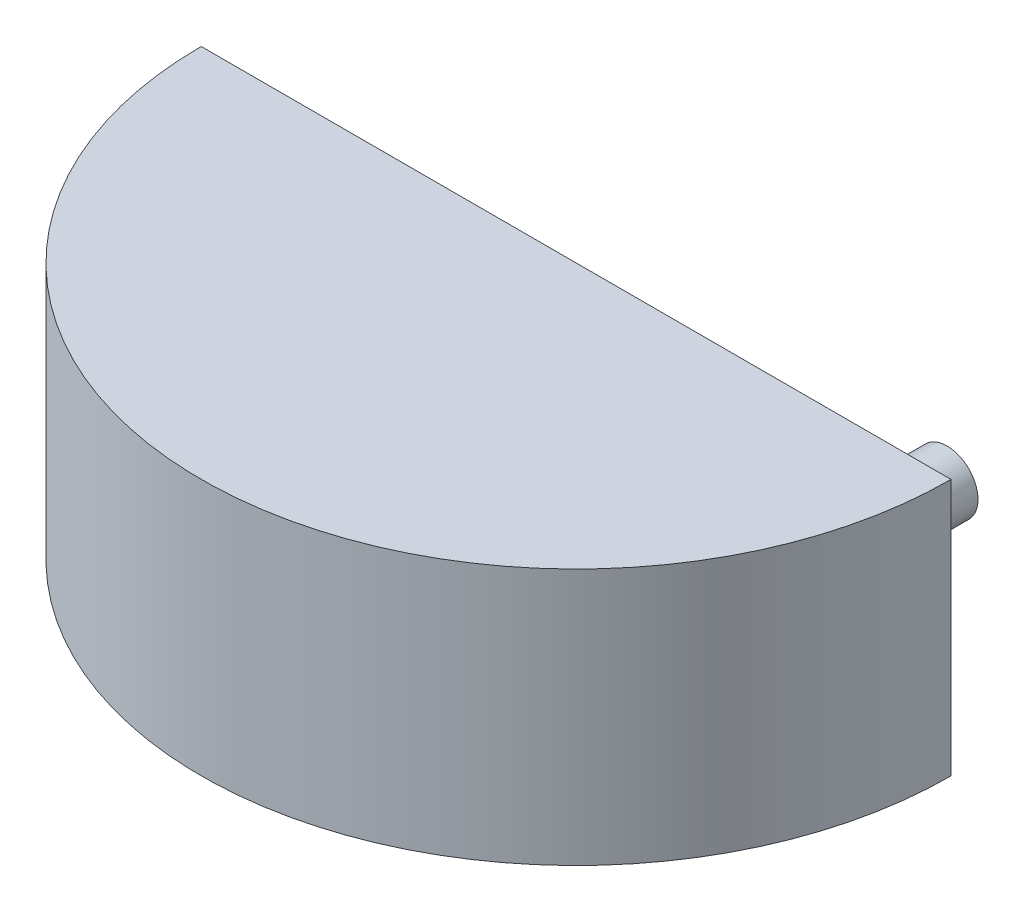
ISO-10303-21;
HEADER;
FILE_DESCRIPTION(('STEP AP214'),'2;1');
FILE_NAME('part.step','',(''),(''),'','','');
FILE_SCHEMA(('AUTOMOTIVE_DESIGN { 1 0 10303 214 1 1 1 1 }'));
ENDSEC;
DATA;
#1=APPLICATION_CONTEXT('core data for automotive mechanical design processes');
#2=APPLICATION_PROTOCOL_DEFINITION('international standard','automotive_design',2000,#1);
#3=PRODUCT_CONTEXT('',#1,'mechanical');
#4=PRODUCT('Part','Part','',(#3));
#5=PRODUCT_RELATED_PRODUCT_CATEGORY('part','',(#4));
#6=PRODUCT_DEFINITION_FORMATION('','',#4);
#7=PRODUCT_DEFINITION_CONTEXT('part definition',#1,'design');
#8=PRODUCT_DEFINITION('design','',#6,#7);
#9=PRODUCT_DEFINITION_SHAPE('','',#8);
#10=(LENGTH_UNIT() NAMED_UNIT(*) SI_UNIT(.MILLI.,.METRE.));
#11=(NAMED_UNIT(*) PLANE_ANGLE_UNIT() SI_UNIT($,.RADIAN.));
#12=(NAMED_UNIT(*) SI_UNIT($,.STERADIAN.) SOLID_ANGLE_UNIT());
#13=UNCERTAINTY_MEASURE_WITH_UNIT(LENGTH_MEASURE(1.E-05),#10,'distance_accuracy_value','');
#14=(GEOMETRIC_REPRESENTATION_CONTEXT(3) GLOBAL_UNCERTAINTY_ASSIGNED_CONTEXT((#13)) GLOBAL_UNIT_ASSIGNED_CONTEXT((#10,
#11,#12)) REPRESENTATION_CONTEXT('',''));
#15=CARTESIAN_POINT('',(0.,0.,0.));
#16=DIRECTION('',(0.,0.,1.));
#17=DIRECTION('',(1.,0.,0.));
#18=AXIS2_PLACEMENT_3D('',#15,#16,#17);
#19=CARTESIAN_POINT('',(0.,0.,0.));
#20=DIRECTION('',(0.,-1.,0.));
#21=DIRECTION('',(1.,0.,0.));
#22=AXIS2_PLACEMENT_3D('',#19,#20,#21);
#23=PLANE('',#22);
#24=DIRECTION('',(-1.,0.,0.));
#25=VECTOR('',#24,1.);
#26=CARTESIAN_POINT('',(0.,0.,0.));
#27=LINE('',#26,#25);
#28=CARTESIAN_POINT('',(-0.79375,0.,0.));
#29=VERTEX_POINT('',#28);
#30=CARTESIAN_POINT('',(-4.11162499999997,0.,0.));
#31=VERTEX_POINT('',#30);
#32=EDGE_CURVE('E60',#29,#31,#27,.T.);
#33=ORIENTED_EDGE('',*,*,#32,.F.);
#34=DIRECTION('',(0.,0.,1.));
#35=VECTOR('',#34,1.);
#36=CARTESIAN_POINT('',(-0.79375,0.,0.));
#37=LINE('',#36,#35);
#38=CARTESIAN_POINT('',(-0.79375,0.,6.35));
#39=VERTEX_POINT('',#38);
#40=EDGE_CURVE('E55',#29,#39,#37,.T.);
#41=ORIENTED_EDGE('',*,*,#40,.T.);
#42=DIRECTION('',(-1.,0.,0.));
#43=VECTOR('',#42,1.);
#44=CARTESIAN_POINT('',(0.,0.,6.35));
#45=LINE('',#44,#43);
#46=CARTESIAN_POINT('',(0.79375,0.,6.35));
#47=VERTEX_POINT('',#46);
#48=EDGE_CURVE('E150',#47,#39,#45,.T.);
#49=ORIENTED_EDGE('',*,*,#48,.F.);
#50=DIRECTION('',(0.,0.,1.));
#51=VECTOR('',#50,1.);
#52=CARTESIAN_POINT('',(0.79375,0.,0.));
#53=LINE('',#52,#51);
#54=CARTESIAN_POINT('',(0.79375,0.,0.));
#55=VERTEX_POINT('',#54);
#56=EDGE_CURVE('E153',#55,#47,#53,.T.);
#57=ORIENTED_EDGE('',*,*,#56,.F.);
#58=CARTESIAN_POINT('',(4.11162499999997,0.,0.));
#59=VERTEX_POINT('',#58);
#60=EDGE_CURVE('E222',#59,#55,#27,.T.);
#61=ORIENTED_EDGE('',*,*,#60,.F.);
#62=CARTESIAN_POINT('',(5.30224999999997,0.,0.));
#63=DIRECTION('',(0.,-1.,0.));
#64=DIRECTION('',(1.,0.,0.));
#65=AXIS2_PLACEMENT_3D('',#62,#63,#64);
#66=CIRCLE('',#65,1.190625);
#67=CARTESIAN_POINT('',(6.49287499999997,0.,0.));
#68=VERTEX_POINT('',#67);
#69=EDGE_CURVE('E185',#68,#59,#66,.T.);
#70=ORIENTED_EDGE('',*,*,#69,.F.);
#71=CARTESIAN_POINT('',(9.27099999999997,0.,0.));
#72=VERTEX_POINT('',#71);
#73=EDGE_CURVE('E218',#72,#68,#27,.T.);
#74=ORIENTED_EDGE('',*,*,#73,.F.);
#75=CARTESIAN_POINT('',(0.,0.,0.));
#76=DIRECTION('',(0.,-1.,0.));
#77=DIRECTION('',(1.,0.,0.));
#78=AXIS2_PLACEMENT_3D('',#75,#76,#77);
#79=CIRCLE('',#78,9.27099999999997);
#80=CARTESIAN_POINT('',(-9.27099999999997,0.,0.));
#81=VERTEX_POINT('',#80);
#82=EDGE_CURVE('E228',#72,#81,#79,.T.);
#83=ORIENTED_EDGE('',*,*,#82,.T.);
#84=CARTESIAN_POINT('',(-6.49287499999997,0.,0.));
#85=VERTEX_POINT('',#84);
#86=EDGE_CURVE('E217',#85,#81,#27,.T.);
#87=ORIENTED_EDGE('',*,*,#86,.F.);
#88=CARTESIAN_POINT('',(-5.30224999999997,0.,0.));
#89=DIRECTION('',(0.,-1.,0.));
#90=DIRECTION('',(1.,0.,0.));
#91=AXIS2_PLACEMENT_3D('',#88,#89,#90);
#92=CIRCLE('',#91,1.190625);
#93=EDGE_CURVE('E184',#31,#85,#92,.T.);
#94=ORIENTED_EDGE('',*,*,#93,.F.);
#95=EDGE_LOOP('',(#33,#41,#49,#57,#61,#70,#74,#83,#87,#94));
#96=FACE_BOUND('',#95,.T.);
#97=ADVANCED_FACE('F40',(#96),#23,.T.);
#98=CARTESIAN_POINT('',(0.,-3.04800000000002,0.));
#99=DIRECTION('',(0.,0.,1.));
#100=DIRECTION('',(1.,0.,0.));
#101=AXIS2_PLACEMENT_3D('',#98,#99,#100);
#102=PLANE('',#101);
#103=DIRECTION('',(-1.,0.,0.));
#104=VECTOR('',#103,1.);
#105=CARTESIAN_POINT('',(0.,1.58749999999998,0.));
#106=LINE('',#105,#104);
#107=CARTESIAN_POINT('',(4.11162499999997,1.58749999999998,0.));
#108=VERTEX_POINT('',#107);
#109=CARTESIAN_POINT('',(-4.11162499999997,1.58749999999998,0.));
#110=VERTEX_POINT('',#109);
#111=EDGE_CURVE('E215',#108,#110,#106,.T.);
#112=ORIENTED_EDGE('',*,*,#111,.F.);
#113=DIRECTION('',(0.,-1.,0.));
#114=VECTOR('',#113,1.);
#115=CARTESIAN_POINT('',(4.11162499999997,3.048,0.));
#116=LINE('',#115,#114);
#117=EDGE_CURVE('E197',#108,#59,#116,.T.);
#118=ORIENTED_EDGE('',*,*,#117,.T.);
#119=ORIENTED_EDGE('',*,*,#60,.T.);
#120=DIRECTION('',(0.,1.,0.));
#121=VECTOR('',#120,1.);
#122=CARTESIAN_POINT('',(0.79375,-0.79375,0.));
#123=LINE('',#122,#121);
#124=CARTESIAN_POINT('',(0.79375,-0.79375,0.));
#125=VERTEX_POINT('',#124);
#126=EDGE_CURVE('E134',#125,#55,#123,.T.);
#127=ORIENTED_EDGE('',*,*,#126,.F.);
#128=DIRECTION('',(1.,0.,0.));
#129=VECTOR('',#128,1.);
#130=CARTESIAN_POINT('',(0.,-0.79375,0.));
#131=LINE('',#130,#129);
#132=CARTESIAN_POINT('',(-0.79375,-0.79375,0.));
#133=VERTEX_POINT('',#132);
#134=EDGE_CURVE('E137',#133,#125,#131,.T.);
#135=ORIENTED_EDGE('',*,*,#134,.F.);
#136=DIRECTION('',(0.,1.,0.));
#137=VECTOR('',#136,1.);
#138=CARTESIAN_POINT('',(-0.79375,-0.79375,0.));
#139=LINE('',#138,#137);
#140=EDGE_CURVE('E127',#133,#29,#139,.T.);
#141=ORIENTED_EDGE('',*,*,#140,.T.);
#142=ORIENTED_EDGE('',*,*,#32,.T.);
#143=DIRECTION('',(0.,-1.,0.));
#144=VECTOR('',#143,1.);
#145=CARTESIAN_POINT('',(-4.11162499999997,3.048,0.));
#146=LINE('',#145,#144);
#147=EDGE_CURVE('E187',#31,#110,#146,.F.);
#148=ORIENTED_EDGE('',*,*,#147,.T.);
#149=EDGE_LOOP('',(#112,#118,#119,#127,#135,#141,#142,#148));
#150=FACE_BOUND('',#149,.T.);
#151=ADVANCED_FACE('F139',(#150),#102,.F.);
#152=CARTESIAN_POINT('',(0.,0.,0.));
#153=DIRECTION('',(0.,-1.,0.));
#154=DIRECTION('',(1.,0.,0.));
#155=AXIS2_PLACEMENT_3D('',#152,#153,#154);
#156=CYLINDRICAL_SURFACE('',#155,9.27099999999997);
#157=DIRECTION('',(0.,-1.,0.));
#158=VECTOR('',#157,1.);
#159=CARTESIAN_POINT('',(9.27099999999997,0.,0.));
#160=LINE('',#159,#158);
#161=CARTESIAN_POINT('',(9.27099999999997,6.34999999999998,0.));
#162=VERTEX_POINT('',#161);
#163=EDGE_CURVE('E214',#162,#72,#160,.T.);
#164=ORIENTED_EDGE('',*,*,#163,.F.);
#165=CARTESIAN_POINT('',(0.,6.35,0.));
#166=DIRECTION('',(0.,-1.,0.));
#167=DIRECTION('',(1.,0.,0.));
#168=AXIS2_PLACEMENT_3D('',#165,#166,#167);
#169=CIRCLE('',#168,9.27099999999997);
#170=CARTESIAN_POINT('',(-9.27099999999997,6.35,0.));
#171=VERTEX_POINT('',#170);
#172=EDGE_CURVE('E225',#162,#171,#169,.T.);
#173=ORIENTED_EDGE('',*,*,#172,.T.);
#174=DIRECTION('',(0.,1.,0.));
#175=VECTOR('',#174,1.);
#176=CARTESIAN_POINT('',(-9.27099999999997,-3.04800000000002,0.));
#177=LINE('',#176,#175);
#178=EDGE_CURVE('E202',#81,#171,#177,.T.);
#179=ORIENTED_EDGE('',*,*,#178,.F.);
#180=ORIENTED_EDGE('',*,*,#82,.F.);
#181=EDGE_LOOP('',(#164,#173,#179,#180));
#182=FACE_BOUND('',#181,.T.);
#183=ADVANCED_FACE('F260',(#182),#156,.T.);
#184=CARTESIAN_POINT('',(0.,6.34999999999998,0.));
#185=DIRECTION('',(0.,1.,0.));
#186=DIRECTION('',(-1.,0.,0.));
#187=AXIS2_PLACEMENT_3D('',#184,#185,#186);
#188=PLANE('',#187);
#189=DIRECTION('',(1.,0.,0.));
#190=VECTOR('',#189,1.);
#191=CARTESIAN_POINT('',(0.,6.34999999999998,0.));
#192=LINE('',#191,#190);
#193=EDGE_CURVE('E200',#171,#162,#192,.T.);
#194=ORIENTED_EDGE('',*,*,#193,.F.);
#195=ORIENTED_EDGE('',*,*,#172,.F.);
#196=EDGE_LOOP('',(#194,#195));
#197=FACE_BOUND('',#196,.T.);
#198=ADVANCED_FACE('F249',(#197),#188,.T.);
#199=CARTESIAN_POINT('',(-8.38199999999997,0.889,0.));
#200=DIRECTION('',(0.,0.,1.));
#201=DIRECTION('',(1.,0.,0.));
#202=AXIS2_PLACEMENT_3D('',#199,#200,#201);
#203=CIRCLE('',#202,0.762000000000001);
#204=CARTESIAN_POINT('',(-7.61999999999997,0.889,0.));
#205=VERTEX_POINT('',#204);
#206=EDGE_CURVE('E11',#205,#205,#203,.F.);
#207=ORIENTED_EDGE('',*,*,#206,.F.);
#208=EDGE_LOOP('',(#207));
#209=FACE_BOUND('',#208,.T.);
#210=CARTESIAN_POINT('',(-8.38199999999997,5.461,0.));
#211=DIRECTION('',(0.,0.,1.));
#212=DIRECTION('',(1.,0.,0.));
#213=AXIS2_PLACEMENT_3D('',#210,#211,#212);
#214=CIRCLE('',#213,0.8255);
#215=CARTESIAN_POINT('',(-7.55649999999997,5.461,0.));
#216=VERTEX_POINT('',#215);
#217=EDGE_CURVE('E170',#216,#216,#214,.T.);
#218=ORIENTED_EDGE('',*,*,#217,.T.);
#219=EDGE_LOOP('',(#218));
#220=FACE_BOUND('',#219,.T.);
#221=CARTESIAN_POINT('',(8.38199999999997,0.889,0.));
#222=DIRECTION('',(0.,0.,1.));
#223=DIRECTION('',(1.,0.,0.));
#224=AXIS2_PLACEMENT_3D('',#221,#222,#223);
#225=CIRCLE('',#224,0.8255);
#226=CARTESIAN_POINT('',(9.20749999999997,0.889,0.));
#227=VERTEX_POINT('',#226);
#228=EDGE_CURVE('E175',#227,#227,#225,.T.);
#229=ORIENTED_EDGE('',*,*,#228,.T.);
#230=EDGE_LOOP('',(#229));
#231=FACE_BOUND('',#230,.T.);
#232=CARTESIAN_POINT('',(8.38199999999997,5.461,0.));
#233=DIRECTION('',(0.,0.,1.));
#234=DIRECTION('',(1.,0.,0.));
#235=AXIS2_PLACEMENT_3D('',#232,#233,#234);
#236=CIRCLE('',#235,0.761999999999999);
#237=CARTESIAN_POINT('',(9.14399999999997,5.461,0.));
#238=VERTEX_POINT('',#237);
#239=EDGE_CURVE('E48',#238,#238,#236,.F.);
#240=ORIENTED_EDGE('',*,*,#239,.F.);
#241=EDGE_LOOP('',(#240));
#242=FACE_BOUND('',#241,.T.);
#243=ORIENTED_EDGE('',*,*,#73,.T.);
#244=DIRECTION('',(0.,-1.,0.));
#245=VECTOR('',#244,1.);
#246=CARTESIAN_POINT('',(6.49287499999997,3.048,0.));
#247=LINE('',#246,#245);
#248=CARTESIAN_POINT('',(6.49287499999997,1.58749999999998,0.));
#249=VERTEX_POINT('',#248);
#250=EDGE_CURVE('E194',#68,#249,#247,.F.);
#251=ORIENTED_EDGE('',*,*,#250,.T.);
#252=CARTESIAN_POINT('',(7.6835,1.58749999999998,0.));
#253=VERTEX_POINT('',#252);
#254=EDGE_CURVE('E211',#253,#249,#106,.T.);
#255=ORIENTED_EDGE('',*,*,#254,.F.);
#256=DIRECTION('',(0.,-1.,0.));
#257=VECTOR('',#256,1.);
#258=CARTESIAN_POINT('',(7.6835,0.,0.));
#259=LINE('',#258,#257);
#260=CARTESIAN_POINT('',(7.6835,4.76249999999998,0.));
#261=VERTEX_POINT('',#260);
#262=EDGE_CURVE('E204',#261,#253,#259,.T.);
#263=ORIENTED_EDGE('',*,*,#262,.F.);
#264=DIRECTION('',(-1.,0.,0.));
#265=VECTOR('',#264,1.);
#266=CARTESIAN_POINT('',(0.,4.76249999999998,0.));
#267=LINE('',#266,#265);
#268=CARTESIAN_POINT('',(-7.6835,4.76249999999998,0.));
#269=VERTEX_POINT('',#268);
#270=EDGE_CURVE('E234',#261,#269,#267,.T.);
#271=ORIENTED_EDGE('',*,*,#270,.T.);
#272=DIRECTION('',(0.,-1.,0.));
#273=VECTOR('',#272,1.);
#274=CARTESIAN_POINT('',(-7.6835,0.,0.));
#275=LINE('',#274,#273);
#276=CARTESIAN_POINT('',(-7.6835,1.58749999999998,0.));
#277=VERTEX_POINT('',#276);
#278=EDGE_CURVE('E207',#277,#269,#275,.F.);
#279=ORIENTED_EDGE('',*,*,#278,.F.);
#280=CARTESIAN_POINT('',(-6.49287499999997,1.58749999999998,0.));
#281=VERTEX_POINT('',#280);
#282=EDGE_CURVE('E210',#281,#277,#106,.T.);
#283=ORIENTED_EDGE('',*,*,#282,.F.);
#284=DIRECTION('',(0.,-1.,0.));
#285=VECTOR('',#284,1.);
#286=CARTESIAN_POINT('',(-6.49287499999997,3.048,0.));
#287=LINE('',#286,#285);
#288=EDGE_CURVE('E191',#281,#85,#287,.T.);
#289=ORIENTED_EDGE('',*,*,#288,.T.);
#290=ORIENTED_EDGE('',*,*,#86,.T.);
#291=ORIENTED_EDGE('',*,*,#178,.T.);
#292=ORIENTED_EDGE('',*,*,#193,.T.);
#293=ORIENTED_EDGE('',*,*,#163,.T.);
#294=EDGE_LOOP('',(#243,#251,#255,#263,#271,#279,#283,#289,#290,#291,#292,#293));
#295=FACE_BOUND('',#294,.T.);
#296=ADVANCED_FACE('F246',(#209,#220,#231,#242,#295),#102,.F.);
#297=CARTESIAN_POINT('',(0.,0.,0.));
#298=DIRECTION('',(0.,-1.,0.));
#299=DIRECTION('',(1.,0.,0.));
#300=AXIS2_PLACEMENT_3D('',#297,#298,#299);
#301=CYLINDRICAL_SURFACE('',#300,7.6835);
#302=CARTESIAN_POINT('',(0.,1.58749999999998,0.));
#303=DIRECTION('',(0.,-1.,0.));
#304=DIRECTION('',(1.,0.,0.));
#305=AXIS2_PLACEMENT_3D('',#302,#303,#304);
#306=CIRCLE('',#305,7.6835);
#307=EDGE_CURVE('E231',#253,#277,#306,.T.);
#308=ORIENTED_EDGE('',*,*,#307,.T.);
#309=ORIENTED_EDGE('',*,*,#278,.T.);
#310=CARTESIAN_POINT('',(0.,4.76249999999998,0.));
#311=DIRECTION('',(0.,-1.,0.));
#312=DIRECTION('',(1.,0.,0.));
#313=AXIS2_PLACEMENT_3D('',#310,#311,#312);
#314=CIRCLE('',#313,7.6835);
#315=EDGE_CURVE('E221',#261,#269,#314,.T.);
#316=ORIENTED_EDGE('',*,*,#315,.F.);
#317=ORIENTED_EDGE('',*,*,#262,.T.);
#318=EDGE_LOOP('',(#308,#309,#316,#317));
#319=FACE_BOUND('',#318,.T.);
#320=ADVANCED_FACE('F42',(#319),#301,.F.);
#321=CARTESIAN_POINT('',(0.,1.58749999999998,0.));
#322=DIRECTION('',(0.,-1.,0.));
#323=DIRECTION('',(1.,0.,0.));
#324=AXIS2_PLACEMENT_3D('',#321,#322,#323);
#325=PLANE('',#324);
#326=ORIENTED_EDGE('',*,*,#254,.T.);
#327=CARTESIAN_POINT('',(5.30224999999997,1.58749999999998,0.));
#328=DIRECTION('',(0.,-1.,0.));
#329=DIRECTION('',(1.,0.,0.));
#330=AXIS2_PLACEMENT_3D('',#327,#328,#329);
#331=CIRCLE('',#330,1.190625);
#332=EDGE_CURVE('E239',#249,#108,#331,.T.);
#333=ORIENTED_EDGE('',*,*,#332,.T.);
#334=ORIENTED_EDGE('',*,*,#111,.T.);
#335=CARTESIAN_POINT('',(-5.30224999999997,1.58749999999998,0.));
#336=DIRECTION('',(0.,-1.,0.));
#337=DIRECTION('',(1.,0.,0.));
#338=AXIS2_PLACEMENT_3D('',#335,#336,#337);
#339=CIRCLE('',#338,1.190625);
#340=EDGE_CURVE('E236',#110,#281,#339,.T.);
#341=ORIENTED_EDGE('',*,*,#340,.T.);
#342=ORIENTED_EDGE('',*,*,#282,.T.);
#343=ORIENTED_EDGE('',*,*,#307,.F.);
#344=EDGE_LOOP('',(#326,#333,#334,#341,#342,#343));
#345=FACE_BOUND('',#344,.T.);
#346=ADVANCED_FACE('F278',(#345),#325,.F.);
#347=CARTESIAN_POINT('',(0.,4.76249999999998,0.));
#348=DIRECTION('',(0.,-1.,0.));
#349=DIRECTION('',(1.,0.,0.));
#350=AXIS2_PLACEMENT_3D('',#347,#348,#349);
#351=PLANE('',#350);
#352=ORIENTED_EDGE('',*,*,#270,.F.);
#353=ORIENTED_EDGE('',*,*,#315,.T.);
#354=EDGE_LOOP('',(#352,#353));
#355=FACE_BOUND('',#354,.T.);
#356=ADVANCED_FACE('F280',(#355),#351,.T.);
#357=CARTESIAN_POINT('',(-5.30224999999997,3.048,0.));
#358=DIRECTION('',(0.,-1.,0.));
#359=DIRECTION('',(1.,0.,0.));
#360=AXIS2_PLACEMENT_3D('',#357,#358,#359);
#361=CYLINDRICAL_SURFACE('',#360,1.190625);
#362=ORIENTED_EDGE('',*,*,#340,.F.);
#363=ORIENTED_EDGE('',*,*,#147,.F.);
#364=ORIENTED_EDGE('',*,*,#93,.T.);
#365=ORIENTED_EDGE('',*,*,#288,.F.);
#366=EDGE_LOOP('',(#362,#363,#364,#365));
#367=FACE_BOUND('',#366,.T.);
#368=ADVANCED_FACE('F286',(#367),#361,.F.);
#369=CARTESIAN_POINT('',(5.30224999999997,3.048,0.));
#370=DIRECTION('',(0.,-1.,0.));
#371=DIRECTION('',(1.,0.,0.));
#372=AXIS2_PLACEMENT_3D('',#369,#370,#371);
#373=CYLINDRICAL_SURFACE('',#372,1.190625);
#374=ORIENTED_EDGE('',*,*,#332,.F.);
#375=ORIENTED_EDGE('',*,*,#250,.F.);
#376=ORIENTED_EDGE('',*,*,#69,.T.);
#377=ORIENTED_EDGE('',*,*,#117,.F.);
#378=EDGE_LOOP('',(#374,#375,#376,#377));
#379=FACE_BOUND('',#378,.T.);
#380=ADVANCED_FACE('F343',(#379),#373,.F.);
#381=CARTESIAN_POINT('',(8.38199999999997,5.461,-0.79375));
#382=DIRECTION('',(0.,0.,1.));
#383=DIRECTION('',(1.,0.,0.));
#384=AXIS2_PLACEMENT_3D('',#381,#382,#383);
#385=CYLINDRICAL_SURFACE('',#384,0.761999999999999);
#386=CARTESIAN_POINT('',(8.38199999999997,5.461,-0.79375));
#387=DIRECTION('',(0.,0.,-1.));
#388=DIRECTION('',(-1.,0.,0.));
#389=AXIS2_PLACEMENT_3D('',#386,#387,#388);
#390=CIRCLE('',#389,0.761999999999999);
#391=CARTESIAN_POINT('',(7.61999999999997,5.461,-0.79375));
#392=VERTEX_POINT('',#391);
#393=EDGE_CURVE('E181',#392,#392,#390,.T.);
#394=ORIENTED_EDGE('',*,*,#393,.F.);
#395=EDGE_LOOP('',(#394));
#396=FACE_BOUND('',#395,.T.);
#397=ORIENTED_EDGE('',*,*,#239,.T.);
#398=EDGE_LOOP('',(#397));
#399=FACE_BOUND('',#398,.T.);
#400=ADVANCED_FACE('F244',(#396,#399),#385,.T.);
#401=CARTESIAN_POINT('',(8.38199999999997,5.461,-0.79375));
#402=DIRECTION('',(0.,0.,-1.));
#403=DIRECTION('',(-1.,0.,0.));
#404=AXIS2_PLACEMENT_3D('',#401,#402,#403);
#405=PLANE('',#404);
#406=ORIENTED_EDGE('',*,*,#393,.T.);
#407=EDGE_LOOP('',(#406));
#408=FACE_BOUND('',#407,.T.);
#409=ADVANCED_FACE('F336',(#408),#405,.T.);
#410=CARTESIAN_POINT('',(-8.38199999999997,0.889,-0.79375));
#411=DIRECTION('',(0.,0.,1.));
#412=DIRECTION('',(1.,0.,0.));
#413=AXIS2_PLACEMENT_3D('',#410,#411,#412);
#414=CYLINDRICAL_SURFACE('',#413,0.762000000000001);
#415=CARTESIAN_POINT('',(-8.38199999999997,0.889,-0.79375));
#416=DIRECTION('',(0.,0.,-1.));
#417=DIRECTION('',(-1.,0.,0.));
#418=AXIS2_PLACEMENT_3D('',#415,#416,#417);
#419=CIRCLE('',#418,0.762000000000001);
#420=CARTESIAN_POINT('',(-9.14399999999997,0.889,-0.79375));
#421=VERTEX_POINT('',#420);
#422=EDGE_CURVE('E178',#421,#421,#419,.T.);
#423=ORIENTED_EDGE('',*,*,#422,.F.);
#424=EDGE_LOOP('',(#423));
#425=FACE_BOUND('',#424,.T.);
#426=ORIENTED_EDGE('',*,*,#206,.T.);
#427=EDGE_LOOP('',(#426));
#428=FACE_BOUND('',#427,.T.);
#429=ADVANCED_FACE('F332',(#425,#428),#414,.T.);
#430=CARTESIAN_POINT('',(-8.38199999999997,0.889,-0.79375));
#431=DIRECTION('',(0.,0.,-1.));
#432=DIRECTION('',(-1.,0.,0.));
#433=AXIS2_PLACEMENT_3D('',#430,#431,#432);
#434=PLANE('',#433);
#435=ORIENTED_EDGE('',*,*,#422,.T.);
#436=EDGE_LOOP('',(#435));
#437=FACE_BOUND('',#436,.T.);
#438=ADVANCED_FACE('F328',(#437),#434,.T.);
#439=CARTESIAN_POINT('',(-8.38199999999997,5.461,0.79375));
#440=DIRECTION('',(0.,0.,-1.));
#441=DIRECTION('',(-1.,0.,0.));
#442=AXIS2_PLACEMENT_3D('',#439,#440,#441);
#443=CYLINDRICAL_SURFACE('',#442,0.8255);
#444=CARTESIAN_POINT('',(-8.38199999999997,5.461,0.79375));
#445=DIRECTION('',(0.,0.,-1.));
#446=DIRECTION('',(-1.,0.,0.));
#447=AXIS2_PLACEMENT_3D('',#444,#445,#446);
#448=CIRCLE('',#447,0.8255);
#449=CARTESIAN_POINT('',(-9.20749999999997,5.461,0.79375));
#450=VERTEX_POINT('',#449);
#451=EDGE_CURVE('E133',#450,#450,#448,.T.);
#452=ORIENTED_EDGE('',*,*,#451,.F.);
#453=EDGE_LOOP('',(#452));
#454=FACE_BOUND('',#453,.T.);
#455=ORIENTED_EDGE('',*,*,#217,.F.);
#456=EDGE_LOOP('',(#455));
#457=FACE_BOUND('',#456,.T.);
#458=ADVANCED_FACE('F324',(#454,#457),#443,.F.);
#459=CARTESIAN_POINT('',(-8.38199999999997,5.461,0.79375));
#460=DIRECTION('',(0.,0.,-1.));
#461=DIRECTION('',(-1.,0.,0.));
#462=AXIS2_PLACEMENT_3D('',#459,#460,#461);
#463=PLANE('',#462);
#464=ORIENTED_EDGE('',*,*,#451,.T.);
#465=EDGE_LOOP('',(#464));
#466=FACE_BOUND('',#465,.T.);
#467=ADVANCED_FACE('F320',(#466),#463,.T.);
#468=CARTESIAN_POINT('',(8.38199999999997,0.889,0.79375));
#469=DIRECTION('',(0.,0.,-1.));
#470=DIRECTION('',(-1.,0.,0.));
#471=AXIS2_PLACEMENT_3D('',#468,#469,#470);
#472=CYLINDRICAL_SURFACE('',#471,0.8255);
#473=CARTESIAN_POINT('',(8.38199999999997,0.889,0.79375));
#474=DIRECTION('',(0.,0.,-1.));
#475=DIRECTION('',(-1.,0.,0.));
#476=AXIS2_PLACEMENT_3D('',#473,#474,#475);
#477=CIRCLE('',#476,0.8255);
#478=CARTESIAN_POINT('',(7.55649999999997,0.889,0.79375));
#479=VERTEX_POINT('',#478);
#480=EDGE_CURVE('E167',#479,#479,#477,.T.);
#481=ORIENTED_EDGE('',*,*,#480,.F.);
#482=EDGE_LOOP('',(#481));
#483=FACE_BOUND('',#482,.T.);
#484=ORIENTED_EDGE('',*,*,#228,.F.);
#485=EDGE_LOOP('',(#484));
#486=FACE_BOUND('',#485,.T.);
#487=ADVANCED_FACE('F316',(#483,#486),#472,.F.);
#488=CARTESIAN_POINT('',(8.38199999999997,0.889,0.79375));
#489=DIRECTION('',(0.,0.,-1.));
#490=DIRECTION('',(-1.,0.,0.));
#491=AXIS2_PLACEMENT_3D('',#488,#489,#490);
#492=PLANE('',#491);
#493=ORIENTED_EDGE('',*,*,#480,.T.);
#494=EDGE_LOOP('',(#493));
#495=FACE_BOUND('',#494,.T.);
#496=ADVANCED_FACE('F313',(#495),#492,.T.);
#497=CARTESIAN_POINT('',(-0.79375,-0.79375,0.));
#498=DIRECTION('',(-1.,0.,0.));
#499=DIRECTION('',(0.,-1.,0.));
#500=AXIS2_PLACEMENT_3D('',#497,#498,#499);
#501=PLANE('',#500);
#502=ORIENTED_EDGE('',*,*,#40,.F.);
#503=ORIENTED_EDGE('',*,*,#140,.F.);
#504=DIRECTION('',(0.,0.,1.));
#505=VECTOR('',#504,1.);
#506=CARTESIAN_POINT('',(-0.79375,-0.79375,0.));
#507=LINE('',#506,#505);
#508=CARTESIAN_POINT('',(-0.79375,-0.79375,6.35));
#509=VERTEX_POINT('',#508);
#510=EDGE_CURVE('E131',#133,#509,#507,.T.);
#511=ORIENTED_EDGE('',*,*,#510,.T.);
#512=DIRECTION('',(0.,1.,0.));
#513=VECTOR('',#512,1.);
#514=CARTESIAN_POINT('',(-0.79375,-0.79375,6.35));
#515=LINE('',#514,#513);
#516=EDGE_CURVE('E158',#509,#39,#515,.T.);
#517=ORIENTED_EDGE('',*,*,#516,.T.);
#518=EDGE_LOOP('',(#502,#503,#511,#517));
#519=FACE_BOUND('',#518,.T.);
#520=ADVANCED_FACE('F129',(#519),#501,.T.);
#521=CARTESIAN_POINT('',(0.79375,-0.79375,0.));
#522=DIRECTION('',(-1.,0.,0.));
#523=DIRECTION('',(0.,-1.,0.));
#524=AXIS2_PLACEMENT_3D('',#521,#522,#523);
#525=PLANE('',#524);
#526=ORIENTED_EDGE('',*,*,#56,.T.);
#527=DIRECTION('',(0.,1.,0.));
#528=VECTOR('',#527,1.);
#529=CARTESIAN_POINT('',(0.79375,-0.79375,6.35));
#530=LINE('',#529,#528);
#531=CARTESIAN_POINT('',(0.79375,-0.79375,6.35));
#532=VERTEX_POINT('',#531);
#533=EDGE_CURVE('E163',#532,#47,#530,.T.);
#534=ORIENTED_EDGE('',*,*,#533,.F.);
#535=DIRECTION('',(0.,0.,1.));
#536=VECTOR('',#535,1.);
#537=CARTESIAN_POINT('',(0.79375,-0.79375,0.));
#538=LINE('',#537,#536);
#539=EDGE_CURVE('E144',#125,#532,#538,.T.);
#540=ORIENTED_EDGE('',*,*,#539,.F.);
#541=ORIENTED_EDGE('',*,*,#126,.T.);
#542=EDGE_LOOP('',(#526,#534,#540,#541));
#543=FACE_BOUND('',#542,.T.);
#544=ADVANCED_FACE('F298',(#543),#525,.F.);
#545=CARTESIAN_POINT('',(0.,-0.79375,6.35));
#546=DIRECTION('',(0.,0.,-1.));
#547=DIRECTION('',(-1.,0.,0.));
#548=AXIS2_PLACEMENT_3D('',#545,#546,#547);
#549=PLANE('',#548);
#550=ORIENTED_EDGE('',*,*,#48,.T.);
#551=ORIENTED_EDGE('',*,*,#516,.F.);
#552=DIRECTION('',(-1.,0.,0.));
#553=VECTOR('',#552,1.);
#554=CARTESIAN_POINT('',(0.,-0.79375,6.35));
#555=LINE('',#554,#553);
#556=EDGE_CURVE('E148',#532,#509,#555,.T.);
#557=ORIENTED_EDGE('',*,*,#556,.F.);
#558=ORIENTED_EDGE('',*,*,#533,.T.);
#559=EDGE_LOOP('',(#550,#551,#557,#558));
#560=FACE_BOUND('',#559,.T.);
#561=ADVANCED_FACE('F301',(#560),#549,.F.);
#562=CARTESIAN_POINT('',(0.,-0.79375,0.));
#563=DIRECTION('',(0.,-1.,0.));
#564=DIRECTION('',(1.,0.,0.));
#565=AXIS2_PLACEMENT_3D('',#562,#563,#564);
#566=PLANE('',#565);
#567=ORIENTED_EDGE('',*,*,#510,.F.);
#568=ORIENTED_EDGE('',*,*,#134,.T.);
#569=ORIENTED_EDGE('',*,*,#539,.T.);
#570=ORIENTED_EDGE('',*,*,#556,.T.);
#571=EDGE_LOOP('',(#567,#568,#569,#570));
#572=FACE_BOUND('',#571,.T.);
#573=ADVANCED_FACE('F146',(#572),#566,.T.);
#574=CLOSED_SHELL('',(#97,#151,#183,#198,#296,#320,#346,#356,#368,#380,#400,#409,#429,#438,#458,
#467,#487,#496,#520,#544,#561,#573));
#575=MANIFOLD_SOLID_BREP('B2',#574);
#576=ADVANCED_BREP_SHAPE_REPRESENTATION('',(#18,#575),#14);
#577=SHAPE_DEFINITION_REPRESENTATION(#9,#576);
ENDSEC;
END-ISO-10303-21;
